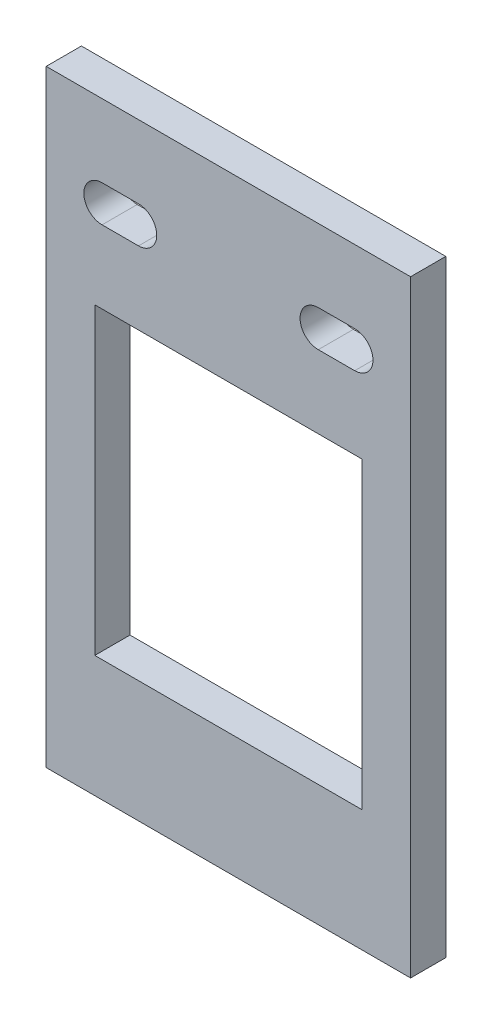
ISO-10303-21;
HEADER;
FILE_DESCRIPTION(('STEP AP214'),'2;1');
FILE_NAME('part.step','',(''),(''),'','','');
FILE_SCHEMA(('AUTOMOTIVE_DESIGN { 1 0 10303 214 1 1 1 1 }'));
ENDSEC;
DATA;
#1=APPLICATION_CONTEXT('core data for automotive mechanical design processes');
#2=APPLICATION_PROTOCOL_DEFINITION('international standard','automotive_design',2000,#1);
#3=PRODUCT_CONTEXT('',#1,'mechanical');
#4=PRODUCT('Part','Part','',(#3));
#5=PRODUCT_RELATED_PRODUCT_CATEGORY('part','',(#4));
#6=PRODUCT_DEFINITION_FORMATION('','',#4);
#7=PRODUCT_DEFINITION_CONTEXT('part definition',#1,'design');
#8=PRODUCT_DEFINITION('design','',#6,#7);
#9=PRODUCT_DEFINITION_SHAPE('','',#8);
#10=(LENGTH_UNIT() NAMED_UNIT(*) SI_UNIT(.MILLI.,.METRE.));
#11=(NAMED_UNIT(*) PLANE_ANGLE_UNIT() SI_UNIT($,.RADIAN.));
#12=(NAMED_UNIT(*) SI_UNIT($,.STERADIAN.) SOLID_ANGLE_UNIT());
#13=UNCERTAINTY_MEASURE_WITH_UNIT(LENGTH_MEASURE(1.E-05),#10,'distance_accuracy_value','');
#14=(GEOMETRIC_REPRESENTATION_CONTEXT(3) GLOBAL_UNCERTAINTY_ASSIGNED_CONTEXT((#13)) GLOBAL_UNIT_ASSIGNED_CONTEXT((#10,
#11,#12)) REPRESENTATION_CONTEXT('',''));
#15=CARTESIAN_POINT('',(0.,0.,0.));
#16=DIRECTION('',(0.,0.,1.));
#17=DIRECTION('',(1.,0.,0.));
#18=AXIS2_PLACEMENT_3D('',#15,#16,#17);
#19=CARTESIAN_POINT('',(0.,0.,1.45));
#20=DIRECTION('',(0.,0.,-1.));
#21=DIRECTION('',(-1.,0.,0.));
#22=AXIS2_PLACEMENT_3D('',#19,#20,#21);
#23=PLANE('',#22);
#24=CARTESIAN_POINT('',(4.6,42.5,1.45));
#25=DIRECTION('',(0.,0.,1.));
#26=DIRECTION('',(1.,0.,0.));
#27=AXIS2_PLACEMENT_3D('',#24,#25,#26);
#28=CIRCLE('',#27,1.5);
#29=CARTESIAN_POINT('',(4.6,44.,1.45));
#30=VERTEX_POINT('',#29);
#31=CARTESIAN_POINT('',(4.6,41.,1.45));
#32=VERTEX_POINT('',#31);
#33=EDGE_CURVE('E201',#30,#32,#28,.T.);
#34=ORIENTED_EDGE('',*,*,#33,.F.);
#35=DIRECTION('',(-1.,0.,0.));
#36=VECTOR('',#35,1.);
#37=CARTESIAN_POINT('',(4.6,44.,1.45));
#38=LINE('',#37,#36);
#39=CARTESIAN_POINT('',(7.6,44.,1.45));
#40=VERTEX_POINT('',#39);
#41=EDGE_CURVE('E212',#40,#30,#38,.T.);
#42=ORIENTED_EDGE('',*,*,#41,.F.);
#43=CARTESIAN_POINT('',(7.6,42.5,1.45));
#44=DIRECTION('',(0.,0.,1.));
#45=DIRECTION('',(1.,0.,0.));
#46=AXIS2_PLACEMENT_3D('',#43,#44,#45);
#47=CIRCLE('',#46,1.5);
#48=CARTESIAN_POINT('',(7.6,41.,1.45));
#49=VERTEX_POINT('',#48);
#50=EDGE_CURVE('E208',#49,#40,#47,.T.);
#51=ORIENTED_EDGE('',*,*,#50,.F.);
#52=DIRECTION('',(1.,0.,0.));
#53=VECTOR('',#52,1.);
#54=CARTESIAN_POINT('',(4.6,41.,1.45));
#55=LINE('',#54,#53);
#56=EDGE_CURVE('E204',#32,#49,#55,.T.);
#57=ORIENTED_EDGE('',*,*,#56,.F.);
#58=EDGE_LOOP('',(#34,#42,#51,#57));
#59=FACE_BOUND('',#58,.T.);
#60=DIRECTION('',(0.,-1.,0.));
#61=VECTOR('',#60,1.);
#62=CARTESIAN_POINT('',(0.,0.,1.45));
#63=LINE('',#62,#61);
#64=CARTESIAN_POINT('',(0.,50.,1.45));
#65=VERTEX_POINT('',#64);
#66=CARTESIAN_POINT('',(0.,0.,1.45));
#67=VERTEX_POINT('',#66);
#68=EDGE_CURVE('E287',#65,#67,#63,.T.);
#69=ORIENTED_EDGE('',*,*,#68,.T.);
#70=DIRECTION('',(1.,0.,0.));
#71=VECTOR('',#70,1.);
#72=CARTESIAN_POINT('',(0.,0.,1.45));
#73=LINE('',#72,#71);
#74=CARTESIAN_POINT('',(30.,0.,1.45));
#75=VERTEX_POINT('',#74);
#76=EDGE_CURVE('E291',#67,#75,#73,.T.);
#77=ORIENTED_EDGE('',*,*,#76,.T.);
#78=DIRECTION('',(0.,1.,0.));
#79=VECTOR('',#78,1.);
#80=CARTESIAN_POINT('',(30.,0.,1.45));
#81=LINE('',#80,#79);
#82=CARTESIAN_POINT('',(30.,50.,1.45));
#83=VERTEX_POINT('',#82);
#84=EDGE_CURVE('E295',#75,#83,#81,.T.);
#85=ORIENTED_EDGE('',*,*,#84,.T.);
#86=DIRECTION('',(-1.,0.,0.));
#87=VECTOR('',#86,1.);
#88=CARTESIAN_POINT('',(0.,50.,1.45));
#89=LINE('',#88,#87);
#90=EDGE_CURVE('E298',#83,#65,#89,.T.);
#91=ORIENTED_EDGE('',*,*,#90,.T.);
#92=EDGE_LOOP('',(#69,#77,#85,#91));
#93=FACE_BOUND('',#92,.T.);
#94=CARTESIAN_POINT('',(22.4,42.5,1.45));
#95=DIRECTION('',(0.,0.,1.));
#96=DIRECTION('',(-1.,0.,0.));
#97=AXIS2_PLACEMENT_3D('',#94,#95,#96);
#98=CIRCLE('',#97,1.5);
#99=CARTESIAN_POINT('',(22.4,44.,1.45));
#100=VERTEX_POINT('',#99);
#101=CARTESIAN_POINT('',(22.4,41.,1.45));
#102=VERTEX_POINT('',#101);
#103=EDGE_CURVE('E244',#100,#102,#98,.T.);
#104=ORIENTED_EDGE('',*,*,#103,.F.);
#105=DIRECTION('',(-1.,0.,0.));
#106=VECTOR('',#105,1.);
#107=CARTESIAN_POINT('',(25.4,44.,1.45));
#108=LINE('',#107,#106);
#109=CARTESIAN_POINT('',(25.4,44.,1.45));
#110=VERTEX_POINT('',#109);
#111=EDGE_CURVE('E255',#110,#100,#108,.T.);
#112=ORIENTED_EDGE('',*,*,#111,.F.);
#113=CARTESIAN_POINT('',(25.4,42.5,1.45));
#114=DIRECTION('',(0.,0.,1.));
#115=DIRECTION('',(-1.,0.,0.));
#116=AXIS2_PLACEMENT_3D('',#113,#114,#115);
#117=CIRCLE('',#116,1.5);
#118=CARTESIAN_POINT('',(25.4,41.,1.45));
#119=VERTEX_POINT('',#118);
#120=EDGE_CURVE('E251',#119,#110,#117,.T.);
#121=ORIENTED_EDGE('',*,*,#120,.F.);
#122=DIRECTION('',(1.,0.,0.));
#123=VECTOR('',#122,1.);
#124=CARTESIAN_POINT('',(25.4,41.,1.45));
#125=LINE('',#124,#123);
#126=EDGE_CURVE('E247',#102,#119,#125,.T.);
#127=ORIENTED_EDGE('',*,*,#126,.F.);
#128=EDGE_LOOP('',(#104,#112,#121,#127));
#129=FACE_BOUND('',#128,.T.);
#130=DIRECTION('',(0.,-1.,0.));
#131=VECTOR('',#130,1.);
#132=CARTESIAN_POINT('',(4.,10.,1.45));
#133=LINE('',#132,#131);
#134=CARTESIAN_POINT('',(4.,35.,1.45));
#135=VERTEX_POINT('',#134);
#136=CARTESIAN_POINT('',(4.,10.,1.45));
#137=VERTEX_POINT('',#136);
#138=EDGE_CURVE('E153',#135,#137,#133,.T.);
#139=ORIENTED_EDGE('',*,*,#138,.F.);
#140=DIRECTION('',(-1.,0.,0.));
#141=VECTOR('',#140,1.);
#142=CARTESIAN_POINT('',(26.,35.,1.45));
#143=LINE('',#142,#141);
#144=CARTESIAN_POINT('',(26.,35.,1.45));
#145=VERTEX_POINT('',#144);
#146=EDGE_CURVE('E179',#145,#135,#143,.T.);
#147=ORIENTED_EDGE('',*,*,#146,.F.);
#148=DIRECTION('',(0.,1.,0.));
#149=VECTOR('',#148,1.);
#150=CARTESIAN_POINT('',(26.,10.,1.45));
#151=LINE('',#150,#149);
#152=CARTESIAN_POINT('',(26.,10.,1.45));
#153=VERTEX_POINT('',#152);
#154=EDGE_CURVE('E175',#153,#145,#151,.T.);
#155=ORIENTED_EDGE('',*,*,#154,.F.);
#156=DIRECTION('',(1.,0.,0.));
#157=VECTOR('',#156,1.);
#158=CARTESIAN_POINT('',(26.,10.,1.45));
#159=LINE('',#158,#157);
#160=EDGE_CURVE('E162',#137,#153,#159,.T.);
#161=ORIENTED_EDGE('',*,*,#160,.F.);
#162=EDGE_LOOP('',(#139,#147,#155,#161));
#163=FACE_BOUND('',#162,.T.);
#164=ADVANCED_FACE('F39',(#59,#93,#129,#163),#23,.F.);
#165=CARTESIAN_POINT('',(0.,0.,-1.45));
#166=DIRECTION('',(0.,0.,-1.));
#167=DIRECTION('',(-1.,0.,0.));
#168=AXIS2_PLACEMENT_3D('',#165,#166,#167);
#169=PLANE('',#168);
#170=DIRECTION('',(0.,-1.,0.));
#171=VECTOR('',#170,1.);
#172=CARTESIAN_POINT('',(0.,0.,-1.45));
#173=LINE('',#172,#171);
#174=CARTESIAN_POINT('',(0.,50.,-1.45));
#175=VERTEX_POINT('',#174);
#176=CARTESIAN_POINT('',(0.,0.,-1.45));
#177=VERTEX_POINT('',#176);
#178=EDGE_CURVE('E286',#175,#177,#173,.T.);
#179=ORIENTED_EDGE('',*,*,#178,.F.);
#180=DIRECTION('',(-1.,0.,0.));
#181=VECTOR('',#180,1.);
#182=CARTESIAN_POINT('',(0.,50.,-1.45));
#183=LINE('',#182,#181);
#184=CARTESIAN_POINT('',(30.,50.,-1.45));
#185=VERTEX_POINT('',#184);
#186=EDGE_CURVE('E292',#185,#175,#183,.T.);
#187=ORIENTED_EDGE('',*,*,#186,.F.);
#188=DIRECTION('',(0.,1.,0.));
#189=VECTOR('',#188,1.);
#190=CARTESIAN_POINT('',(30.,0.,-1.45));
#191=LINE('',#190,#189);
#192=CARTESIAN_POINT('',(30.,0.,-1.45));
#193=VERTEX_POINT('',#192);
#194=EDGE_CURVE('E308',#193,#185,#191,.T.);
#195=ORIENTED_EDGE('',*,*,#194,.F.);
#196=DIRECTION('',(1.,0.,0.));
#197=VECTOR('',#196,1.);
#198=CARTESIAN_POINT('',(0.,0.,-1.45));
#199=LINE('',#198,#197);
#200=EDGE_CURVE('E305',#177,#193,#199,.T.);
#201=ORIENTED_EDGE('',*,*,#200,.F.);
#202=EDGE_LOOP('',(#179,#187,#195,#201));
#203=FACE_BOUND('',#202,.T.);
#204=DIRECTION('',(-1.,0.,0.));
#205=VECTOR('',#204,1.);
#206=CARTESIAN_POINT('',(25.4,44.,-1.45));
#207=LINE('',#206,#205);
#208=CARTESIAN_POINT('',(25.4,44.,-1.45));
#209=VERTEX_POINT('',#208);
#210=CARTESIAN_POINT('',(22.4,44.,-1.45));
#211=VERTEX_POINT('',#210);
#212=EDGE_CURVE('E248',#209,#211,#207,.T.);
#213=ORIENTED_EDGE('',*,*,#212,.T.);
#214=CARTESIAN_POINT('',(22.4,42.5,-1.45));
#215=DIRECTION('',(0.,0.,1.));
#216=DIRECTION('',(-1.,0.,0.));
#217=AXIS2_PLACEMENT_3D('',#214,#215,#216);
#218=CIRCLE('',#217,1.5);
#219=CARTESIAN_POINT('',(22.4,41.,-1.45));
#220=VERTEX_POINT('',#219);
#221=EDGE_CURVE('E243',#211,#220,#218,.T.);
#222=ORIENTED_EDGE('',*,*,#221,.T.);
#223=DIRECTION('',(1.,0.,0.));
#224=VECTOR('',#223,1.);
#225=CARTESIAN_POINT('',(25.4,41.,-1.45));
#226=LINE('',#225,#224);
#227=CARTESIAN_POINT('',(25.4,41.,-1.45));
#228=VERTEX_POINT('',#227);
#229=EDGE_CURVE('E262',#220,#228,#226,.T.);
#230=ORIENTED_EDGE('',*,*,#229,.T.);
#231=CARTESIAN_POINT('',(25.4,42.5,-1.45));
#232=DIRECTION('',(0.,0.,1.));
#233=DIRECTION('',(-1.,0.,0.));
#234=AXIS2_PLACEMENT_3D('',#231,#232,#233);
#235=CIRCLE('',#234,1.5);
#236=EDGE_CURVE('E266',#228,#209,#235,.T.);
#237=ORIENTED_EDGE('',*,*,#236,.T.);
#238=EDGE_LOOP('',(#213,#222,#230,#237));
#239=FACE_BOUND('',#238,.T.);
#240=DIRECTION('',(-1.,0.,0.));
#241=VECTOR('',#240,1.);
#242=CARTESIAN_POINT('',(4.6,44.,-1.45));
#243=LINE('',#242,#241);
#244=CARTESIAN_POINT('',(7.6,44.,-1.45));
#245=VERTEX_POINT('',#244);
#246=CARTESIAN_POINT('',(4.6,44.,-1.45));
#247=VERTEX_POINT('',#246);
#248=EDGE_CURVE('E205',#245,#247,#243,.T.);
#249=ORIENTED_EDGE('',*,*,#248,.T.);
#250=CARTESIAN_POINT('',(4.6,42.5,-1.45));
#251=DIRECTION('',(0.,0.,1.));
#252=DIRECTION('',(1.,0.,0.));
#253=AXIS2_PLACEMENT_3D('',#250,#251,#252);
#254=CIRCLE('',#253,1.5);
#255=CARTESIAN_POINT('',(4.6,41.,-1.45));
#256=VERTEX_POINT('',#255);
#257=EDGE_CURVE('E171',#247,#256,#254,.T.);
#258=ORIENTED_EDGE('',*,*,#257,.T.);
#259=DIRECTION('',(1.,0.,0.));
#260=VECTOR('',#259,1.);
#261=CARTESIAN_POINT('',(4.6,41.,-1.45));
#262=LINE('',#261,#260);
#263=CARTESIAN_POINT('',(7.6,41.,-1.45));
#264=VERTEX_POINT('',#263);
#265=EDGE_CURVE('E219',#256,#264,#262,.T.);
#266=ORIENTED_EDGE('',*,*,#265,.T.);
#267=CARTESIAN_POINT('',(7.6,42.5,-1.45));
#268=DIRECTION('',(0.,0.,1.));
#269=DIRECTION('',(1.,0.,0.));
#270=AXIS2_PLACEMENT_3D('',#267,#268,#269);
#271=CIRCLE('',#270,1.5);
#272=EDGE_CURVE('E223',#264,#245,#271,.T.);
#273=ORIENTED_EDGE('',*,*,#272,.T.);
#274=EDGE_LOOP('',(#249,#258,#266,#273));
#275=FACE_BOUND('',#274,.T.);
#276=DIRECTION('',(-1.,0.,0.));
#277=VECTOR('',#276,1.);
#278=CARTESIAN_POINT('',(26.,35.,-1.45));
#279=LINE('',#278,#277);
#280=CARTESIAN_POINT('',(26.,35.,-1.45));
#281=VERTEX_POINT('',#280);
#282=CARTESIAN_POINT('',(4.,35.,-1.45));
#283=VERTEX_POINT('',#282);
#284=EDGE_CURVE('E163',#281,#283,#279,.T.);
#285=ORIENTED_EDGE('',*,*,#284,.T.);
#286=DIRECTION('',(0.,-1.,0.));
#287=VECTOR('',#286,1.);
#288=CARTESIAN_POINT('',(4.,10.,-1.45));
#289=LINE('',#288,#287);
#290=CARTESIAN_POINT('',(4.,10.,-1.45));
#291=VERTEX_POINT('',#290);
#292=EDGE_CURVE('E63',#283,#291,#289,.T.);
#293=ORIENTED_EDGE('',*,*,#292,.T.);
#294=DIRECTION('',(1.,0.,0.));
#295=VECTOR('',#294,1.);
#296=CARTESIAN_POINT('',(26.,10.,-1.45));
#297=LINE('',#296,#295);
#298=CARTESIAN_POINT('',(26.,10.,-1.45));
#299=VERTEX_POINT('',#298);
#300=EDGE_CURVE('E169',#291,#299,#297,.T.);
#301=ORIENTED_EDGE('',*,*,#300,.T.);
#302=DIRECTION('',(0.,1.,0.));
#303=VECTOR('',#302,1.);
#304=CARTESIAN_POINT('',(26.,10.,-1.45));
#305=LINE('',#304,#303);
#306=EDGE_CURVE('E188',#299,#281,#305,.T.);
#307=ORIENTED_EDGE('',*,*,#306,.T.);
#308=EDGE_LOOP('',(#285,#293,#301,#307));
#309=FACE_BOUND('',#308,.T.);
#310=ADVANCED_FACE('F331',(#203,#239,#275,#309),#169,.T.);
#311=CARTESIAN_POINT('',(0.,0.,1.45));
#312=DIRECTION('',(1.,0.,0.));
#313=DIRECTION('',(0.,1.,0.));
#314=AXIS2_PLACEMENT_3D('',#311,#312,#313);
#315=PLANE('',#314);
#316=ORIENTED_EDGE('',*,*,#178,.T.);
#317=DIRECTION('',(0.,0.,-1.));
#318=VECTOR('',#317,1.);
#319=CARTESIAN_POINT('',(0.,0.,1.45));
#320=LINE('',#319,#318);
#321=EDGE_CURVE('E11',#67,#177,#320,.T.);
#322=ORIENTED_EDGE('',*,*,#321,.F.);
#323=ORIENTED_EDGE('',*,*,#68,.F.);
#324=DIRECTION('',(0.,0.,-1.));
#325=VECTOR('',#324,1.);
#326=CARTESIAN_POINT('',(0.,50.,1.45));
#327=LINE('',#326,#325);
#328=EDGE_CURVE('E301',#65,#175,#327,.T.);
#329=ORIENTED_EDGE('',*,*,#328,.T.);
#330=EDGE_LOOP('',(#316,#322,#323,#329));
#331=FACE_BOUND('',#330,.T.);
#332=ADVANCED_FACE('F41',(#331),#315,.F.);
#333=CARTESIAN_POINT('',(0.,0.,1.45));
#334=DIRECTION('',(0.,1.,0.));
#335=DIRECTION('',(0.,0.,1.));
#336=AXIS2_PLACEMENT_3D('',#333,#334,#335);
#337=PLANE('',#336);
#338=ORIENTED_EDGE('',*,*,#200,.T.);
#339=DIRECTION('',(0.,0.,-1.));
#340=VECTOR('',#339,1.);
#341=CARTESIAN_POINT('',(30.,0.,1.45));
#342=LINE('',#341,#340);
#343=EDGE_CURVE('E48',#75,#193,#342,.T.);
#344=ORIENTED_EDGE('',*,*,#343,.F.);
#345=ORIENTED_EDGE('',*,*,#76,.F.);
#346=ORIENTED_EDGE('',*,*,#321,.T.);
#347=EDGE_LOOP('',(#338,#344,#345,#346));
#348=FACE_BOUND('',#347,.T.);
#349=ADVANCED_FACE('F342',(#348),#337,.F.);
#350=CARTESIAN_POINT('',(30.,0.,1.45));
#351=DIRECTION('',(-1.,0.,0.));
#352=DIRECTION('',(0.,-1.,0.));
#353=AXIS2_PLACEMENT_3D('',#350,#351,#352);
#354=PLANE('',#353);
#355=ORIENTED_EDGE('',*,*,#194,.T.);
#356=DIRECTION('',(0.,0.,-1.));
#357=VECTOR('',#356,1.);
#358=CARTESIAN_POINT('',(30.,50.,1.45));
#359=LINE('',#358,#357);
#360=EDGE_CURVE('E316',#83,#185,#359,.T.);
#361=ORIENTED_EDGE('',*,*,#360,.F.);
#362=ORIENTED_EDGE('',*,*,#84,.F.);
#363=ORIENTED_EDGE('',*,*,#343,.T.);
#364=EDGE_LOOP('',(#355,#361,#362,#363));
#365=FACE_BOUND('',#364,.T.);
#366=ADVANCED_FACE('F325',(#365),#354,.F.);
#367=CARTESIAN_POINT('',(0.,50.,1.45));
#368=DIRECTION('',(0.,-1.,0.));
#369=DIRECTION('',(0.,0.,-1.));
#370=AXIS2_PLACEMENT_3D('',#367,#368,#369);
#371=PLANE('',#370);
#372=ORIENTED_EDGE('',*,*,#186,.T.);
#373=ORIENTED_EDGE('',*,*,#328,.F.);
#374=ORIENTED_EDGE('',*,*,#90,.F.);
#375=ORIENTED_EDGE('',*,*,#360,.T.);
#376=EDGE_LOOP('',(#372,#373,#374,#375));
#377=FACE_BOUND('',#376,.T.);
#378=ADVANCED_FACE('F335',(#377),#371,.F.);
#379=CARTESIAN_POINT('',(22.4,42.5,1.45));
#380=DIRECTION('',(0.,0.,-1.));
#381=DIRECTION('',(-1.,0.,0.));
#382=AXIS2_PLACEMENT_3D('',#379,#380,#381);
#383=CYLINDRICAL_SURFACE('',#382,1.5);
#384=ORIENTED_EDGE('',*,*,#221,.F.);
#385=DIRECTION('',(0.,0.,-1.));
#386=VECTOR('',#385,1.);
#387=CARTESIAN_POINT('',(22.4,44.,1.45));
#388=LINE('',#387,#386);
#389=EDGE_CURVE('E258',#100,#211,#388,.T.);
#390=ORIENTED_EDGE('',*,*,#389,.F.);
#391=ORIENTED_EDGE('',*,*,#103,.T.);
#392=DIRECTION('',(0.,0.,-1.));
#393=VECTOR('',#392,1.);
#394=CARTESIAN_POINT('',(22.4,41.,1.45));
#395=LINE('',#394,#393);
#396=EDGE_CURVE('E282',#102,#220,#395,.T.);
#397=ORIENTED_EDGE('',*,*,#396,.T.);
#398=EDGE_LOOP('',(#384,#390,#391,#397));
#399=FACE_BOUND('',#398,.T.);
#400=ADVANCED_FACE('F358',(#399),#383,.F.);
#401=CARTESIAN_POINT('',(25.4,41.,1.45));
#402=DIRECTION('',(0.,1.,0.));
#403=DIRECTION('',(0.,0.,1.));
#404=AXIS2_PLACEMENT_3D('',#401,#402,#403);
#405=PLANE('',#404);
#406=ORIENTED_EDGE('',*,*,#229,.F.);
#407=ORIENTED_EDGE('',*,*,#396,.F.);
#408=ORIENTED_EDGE('',*,*,#126,.T.);
#409=DIRECTION('',(0.,0.,-1.));
#410=VECTOR('',#409,1.);
#411=CARTESIAN_POINT('',(25.4,41.,1.45));
#412=LINE('',#411,#410);
#413=EDGE_CURVE('E279',#119,#228,#412,.T.);
#414=ORIENTED_EDGE('',*,*,#413,.T.);
#415=EDGE_LOOP('',(#406,#407,#408,#414));
#416=FACE_BOUND('',#415,.T.);
#417=ADVANCED_FACE('F365',(#416),#405,.T.);
#418=CARTESIAN_POINT('',(25.4,42.5,1.45));
#419=DIRECTION('',(0.,0.,-1.));
#420=DIRECTION('',(-1.,0.,0.));
#421=AXIS2_PLACEMENT_3D('',#418,#419,#420);
#422=CYLINDRICAL_SURFACE('',#421,1.5);
#423=ORIENTED_EDGE('',*,*,#236,.F.);
#424=ORIENTED_EDGE('',*,*,#413,.F.);
#425=ORIENTED_EDGE('',*,*,#120,.T.);
#426=DIRECTION('',(0.,0.,-1.));
#427=VECTOR('',#426,1.);
#428=CARTESIAN_POINT('',(25.4,44.,1.45));
#429=LINE('',#428,#427);
#430=EDGE_CURVE('E276',#110,#209,#429,.T.);
#431=ORIENTED_EDGE('',*,*,#430,.T.);
#432=EDGE_LOOP('',(#423,#424,#425,#431));
#433=FACE_BOUND('',#432,.T.);
#434=ADVANCED_FACE('F370',(#433),#422,.F.);
#435=CARTESIAN_POINT('',(25.4,44.,1.45));
#436=DIRECTION('',(0.,-1.,0.));
#437=DIRECTION('',(0.,0.,-1.));
#438=AXIS2_PLACEMENT_3D('',#435,#436,#437);
#439=PLANE('',#438);
#440=ORIENTED_EDGE('',*,*,#212,.F.);
#441=ORIENTED_EDGE('',*,*,#430,.F.);
#442=ORIENTED_EDGE('',*,*,#111,.T.);
#443=ORIENTED_EDGE('',*,*,#389,.T.);
#444=EDGE_LOOP('',(#440,#441,#442,#443));
#445=FACE_BOUND('',#444,.T.);
#446=ADVANCED_FACE('F377',(#445),#439,.T.);
#447=CARTESIAN_POINT('',(4.6,42.5,1.45));
#448=DIRECTION('',(0.,0.,-1.));
#449=DIRECTION('',(-1.,0.,0.));
#450=AXIS2_PLACEMENT_3D('',#447,#448,#449);
#451=CYLINDRICAL_SURFACE('',#450,1.5);
#452=ORIENTED_EDGE('',*,*,#257,.F.);
#453=DIRECTION('',(0.,0.,-1.));
#454=VECTOR('',#453,1.);
#455=CARTESIAN_POINT('',(4.6,44.,1.45));
#456=LINE('',#455,#454);
#457=EDGE_CURVE('E215',#30,#247,#456,.T.);
#458=ORIENTED_EDGE('',*,*,#457,.F.);
#459=ORIENTED_EDGE('',*,*,#33,.T.);
#460=DIRECTION('',(0.,0.,-1.));
#461=VECTOR('',#460,1.);
#462=CARTESIAN_POINT('',(4.6,41.,1.45));
#463=LINE('',#462,#461);
#464=EDGE_CURVE('E239',#32,#256,#463,.T.);
#465=ORIENTED_EDGE('',*,*,#464,.T.);
#466=EDGE_LOOP('',(#452,#458,#459,#465));
#467=FACE_BOUND('',#466,.T.);
#468=ADVANCED_FACE('F390',(#467),#451,.F.);
#469=CARTESIAN_POINT('',(4.6,41.,1.45));
#470=DIRECTION('',(0.,1.,0.));
#471=DIRECTION('',(0.,0.,1.));
#472=AXIS2_PLACEMENT_3D('',#469,#470,#471);
#473=PLANE('',#472);
#474=ORIENTED_EDGE('',*,*,#265,.F.);
#475=ORIENTED_EDGE('',*,*,#464,.F.);
#476=ORIENTED_EDGE('',*,*,#56,.T.);
#477=DIRECTION('',(0.,0.,-1.));
#478=VECTOR('',#477,1.);
#479=CARTESIAN_POINT('',(7.6,41.,1.45));
#480=LINE('',#479,#478);
#481=EDGE_CURVE('E236',#49,#264,#480,.T.);
#482=ORIENTED_EDGE('',*,*,#481,.T.);
#483=EDGE_LOOP('',(#474,#475,#476,#482));
#484=FACE_BOUND('',#483,.T.);
#485=ADVANCED_FACE('F395',(#484),#473,.T.);
#486=CARTESIAN_POINT('',(7.6,42.5,1.45));
#487=DIRECTION('',(0.,0.,-1.));
#488=DIRECTION('',(-1.,0.,0.));
#489=AXIS2_PLACEMENT_3D('',#486,#487,#488);
#490=CYLINDRICAL_SURFACE('',#489,1.5);
#491=ORIENTED_EDGE('',*,*,#272,.F.);
#492=ORIENTED_EDGE('',*,*,#481,.F.);
#493=ORIENTED_EDGE('',*,*,#50,.T.);
#494=DIRECTION('',(0.,0.,-1.));
#495=VECTOR('',#494,1.);
#496=CARTESIAN_POINT('',(7.6,44.,1.45));
#497=LINE('',#496,#495);
#498=EDGE_CURVE('E233',#40,#245,#497,.T.);
#499=ORIENTED_EDGE('',*,*,#498,.T.);
#500=EDGE_LOOP('',(#491,#492,#493,#499));
#501=FACE_BOUND('',#500,.T.);
#502=ADVANCED_FACE('F399',(#501),#490,.F.);
#503=CARTESIAN_POINT('',(4.6,44.,1.45));
#504=DIRECTION('',(0.,-1.,0.));
#505=DIRECTION('',(0.,0.,-1.));
#506=AXIS2_PLACEMENT_3D('',#503,#504,#505);
#507=PLANE('',#506);
#508=ORIENTED_EDGE('',*,*,#248,.F.);
#509=ORIENTED_EDGE('',*,*,#498,.F.);
#510=ORIENTED_EDGE('',*,*,#41,.T.);
#511=ORIENTED_EDGE('',*,*,#457,.T.);
#512=EDGE_LOOP('',(#508,#509,#510,#511));
#513=FACE_BOUND('',#512,.T.);
#514=ADVANCED_FACE('F403',(#513),#507,.T.);
#515=CARTESIAN_POINT('',(4.,10.,1.45));
#516=DIRECTION('',(1.,0.,0.));
#517=DIRECTION('',(0.,0.,-1.));
#518=AXIS2_PLACEMENT_3D('',#515,#516,#517);
#519=PLANE('',#518);
#520=ORIENTED_EDGE('',*,*,#292,.F.);
#521=DIRECTION('',(0.,0.,-1.));
#522=VECTOR('',#521,1.);
#523=CARTESIAN_POINT('',(4.,35.,1.45));
#524=LINE('',#523,#522);
#525=EDGE_CURVE('E157',#135,#283,#524,.T.);
#526=ORIENTED_EDGE('',*,*,#525,.F.);
#527=ORIENTED_EDGE('',*,*,#138,.T.);
#528=DIRECTION('',(0.,0.,-1.));
#529=VECTOR('',#528,1.);
#530=CARTESIAN_POINT('',(4.,10.,1.45));
#531=LINE('',#530,#529);
#532=EDGE_CURVE('E156',#137,#291,#531,.T.);
#533=ORIENTED_EDGE('',*,*,#532,.T.);
#534=EDGE_LOOP('',(#520,#526,#527,#533));
#535=FACE_BOUND('',#534,.T.);
#536=ADVANCED_FACE('F155',(#535),#519,.T.);
#537=CARTESIAN_POINT('',(26.,10.,1.45));
#538=DIRECTION('',(0.,1.,0.));
#539=DIRECTION('',(-1.,0.,0.));
#540=AXIS2_PLACEMENT_3D('',#537,#538,#539);
#541=PLANE('',#540);
#542=ORIENTED_EDGE('',*,*,#300,.F.);
#543=ORIENTED_EDGE('',*,*,#532,.F.);
#544=ORIENTED_EDGE('',*,*,#160,.T.);
#545=DIRECTION('',(0.,0.,-1.));
#546=VECTOR('',#545,1.);
#547=CARTESIAN_POINT('',(26.,10.,1.45));
#548=LINE('',#547,#546);
#549=EDGE_CURVE('E172',#153,#299,#548,.T.);
#550=ORIENTED_EDGE('',*,*,#549,.T.);
#551=EDGE_LOOP('',(#542,#543,#544,#550));
#552=FACE_BOUND('',#551,.T.);
#553=ADVANCED_FACE('F166',(#552),#541,.T.);
#554=CARTESIAN_POINT('',(26.,10.,1.45));
#555=DIRECTION('',(-1.,0.,0.));
#556=DIRECTION('',(0.,0.,1.));
#557=AXIS2_PLACEMENT_3D('',#554,#555,#556);
#558=PLANE('',#557);
#559=ORIENTED_EDGE('',*,*,#306,.F.);
#560=ORIENTED_EDGE('',*,*,#549,.F.);
#561=ORIENTED_EDGE('',*,*,#154,.T.);
#562=DIRECTION('',(0.,0.,-1.));
#563=VECTOR('',#562,1.);
#564=CARTESIAN_POINT('',(26.,35.,1.45));
#565=LINE('',#564,#563);
#566=EDGE_CURVE('E55',#145,#281,#565,.T.);
#567=ORIENTED_EDGE('',*,*,#566,.T.);
#568=EDGE_LOOP('',(#559,#560,#561,#567));
#569=FACE_BOUND('',#568,.T.);
#570=ADVANCED_FACE('F412',(#569),#558,.T.);
#571=CARTESIAN_POINT('',(26.,35.,1.45));
#572=DIRECTION('',(0.,-1.,0.));
#573=DIRECTION('',(0.,0.,-1.));
#574=AXIS2_PLACEMENT_3D('',#571,#572,#573);
#575=PLANE('',#574);
#576=ORIENTED_EDGE('',*,*,#284,.F.);
#577=ORIENTED_EDGE('',*,*,#566,.F.);
#578=ORIENTED_EDGE('',*,*,#146,.T.);
#579=ORIENTED_EDGE('',*,*,#525,.T.);
#580=EDGE_LOOP('',(#576,#577,#578,#579));
#581=FACE_BOUND('',#580,.T.);
#582=ADVANCED_FACE('F415',(#581),#575,.T.);
#583=CLOSED_SHELL('',(#164,#310,#332,#349,#366,#378,#400,#417,#434,#446,#468,#485,#502,#514,
#536,#553,#570,#582));
#584=MANIFOLD_SOLID_BREP('B2',#583);
#585=ADVANCED_BREP_SHAPE_REPRESENTATION('',(#18,#584),#14);
#586=SHAPE_DEFINITION_REPRESENTATION(#9,#585);
ENDSEC;
END-ISO-10303-21;
